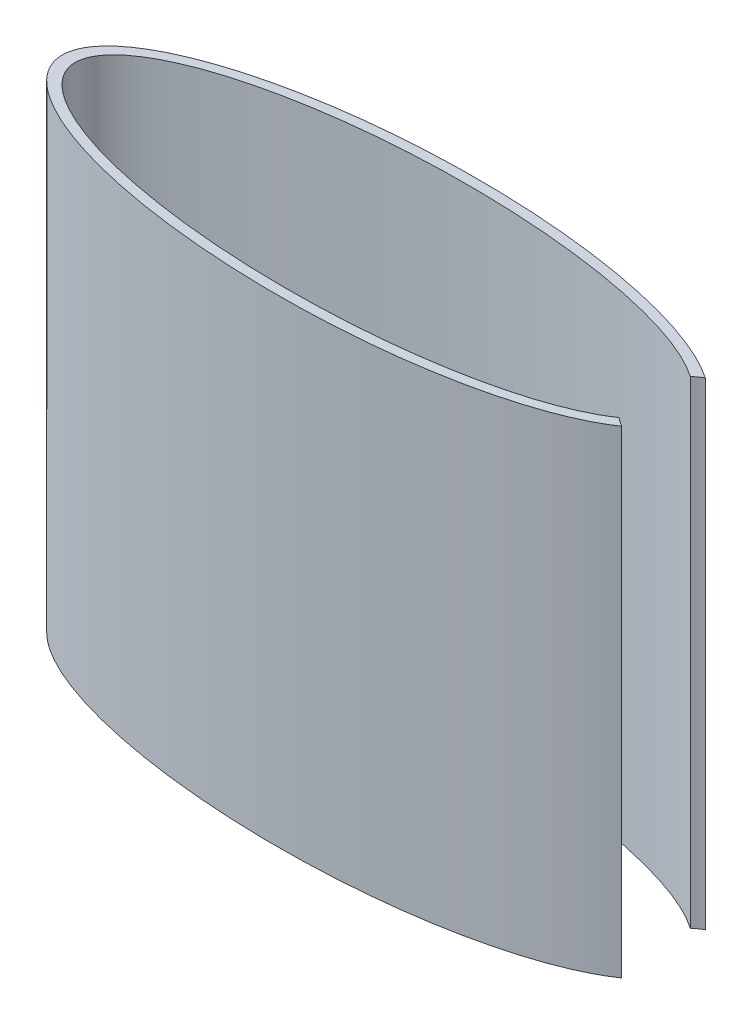
ISO-10303-21;
HEADER;
FILE_DESCRIPTION(('STEP AP214'),'2;1');
FILE_NAME('part.step','',(''),(''),'','','');
FILE_SCHEMA(('AUTOMOTIVE_DESIGN { 1 0 10303 214 1 1 1 1 }'));
ENDSEC;
DATA;
#1=APPLICATION_CONTEXT('core data for automotive mechanical design processes');
#2=APPLICATION_PROTOCOL_DEFINITION('international standard','automotive_design',2000,#1);
#3=PRODUCT_CONTEXT('',#1,'mechanical');
#4=PRODUCT('Part','Part','',(#3));
#5=PRODUCT_RELATED_PRODUCT_CATEGORY('part','',(#4));
#6=PRODUCT_DEFINITION_FORMATION('','',#4);
#7=PRODUCT_DEFINITION_CONTEXT('part definition',#1,'design');
#8=PRODUCT_DEFINITION('design','',#6,#7);
#9=PRODUCT_DEFINITION_SHAPE('','',#8);
#10=(LENGTH_UNIT() NAMED_UNIT(*) SI_UNIT(.MILLI.,.METRE.));
#11=(NAMED_UNIT(*) PLANE_ANGLE_UNIT() SI_UNIT($,.RADIAN.));
#12=(NAMED_UNIT(*) SI_UNIT($,.STERADIAN.) SOLID_ANGLE_UNIT());
#13=UNCERTAINTY_MEASURE_WITH_UNIT(LENGTH_MEASURE(1.E-05),#10,'distance_accuracy_value','');
#14=(GEOMETRIC_REPRESENTATION_CONTEXT(3) GLOBAL_UNCERTAINTY_ASSIGNED_CONTEXT((#13)) GLOBAL_UNIT_ASSIGNED_CONTEXT((#10,
#11,#12)) REPRESENTATION_CONTEXT('',''));
#15=CARTESIAN_POINT('',(0.,0.,0.));
#16=DIRECTION('',(0.,0.,1.));
#17=DIRECTION('',(1.,0.,0.));
#18=AXIS2_PLACEMENT_3D('',#15,#16,#17);
#19=CARTESIAN_POINT('',(0.,127.254,0.));
#20=DIRECTION('',(0.,1.,0.));
#21=DIRECTION('',(0.,0.,1.));
#22=AXIS2_PLACEMENT_3D('',#19,#20,#21);
#23=PLANE('',#22);
#24=CARTESIAN_POINT('',(82.3627691038665,127.254,0.));
#25=DIRECTION('',(0.,1.,0.));
#26=DIRECTION('',(0.,0.,1.));
#27=AXIS2_PLACEMENT_3D('',#24,#25,#26);
#28=CIRCLE('',#27,12.6958795261866);
#29=CARTESIAN_POINT('',(76.2476691465208,127.254,-11.1261363219724));
#30=VERTEX_POINT('',#29);
#31=CARTESIAN_POINT('',(73.9121560052995,127.254,-9.4748348377041));
#32=VERTEX_POINT('',#31);
#33=EDGE_CURVE('E56',#30,#32,#28,.T.);
#34=ORIENTED_EDGE('',*,*,#33,.F.);
#35=CARTESIAN_POINT('',(0.,127.254,0.));
#36=DIRECTION('',(0.,1.,0.));
#37=DIRECTION('',(1.,0.,0.));
#38=AXIS2_PLACEMENT_3D('',#35,#36,#37);
#39=ELLIPSE('',#38,83.8671239744498,26.7152011392463);
#40=CARTESIAN_POINT('',(76.2476691465208,127.254,11.1261363219724));
#41=VERTEX_POINT('',#40);
#42=EDGE_CURVE('E85',#30,#41,#39,.T.);
#43=ORIENTED_EDGE('',*,*,#42,.T.);
#44=CARTESIAN_POINT('',(73.9121560052995,127.254,9.4748348377041));
#45=VERTEX_POINT('',#44);
#46=EDGE_CURVE('E88',#45,#41,#28,.T.);
#47=ORIENTED_EDGE('',*,*,#46,.F.);
#48=CARTESIAN_POINT('',(0.,127.254,0.));
#49=DIRECTION('',(0.,1.,0.));
#50=DIRECTION('',(1.,0.,0.));
#51=AXIS2_PLACEMENT_3D('',#48,#49,#50);
#52=ELLIPSE('',#51,80.4114263146468,24.0569721701671);
#53=EDGE_CURVE('E87',#32,#45,#52,.T.);
#54=ORIENTED_EDGE('',*,*,#53,.F.);
#55=EDGE_LOOP('',(#34,#43,#47,#54));
#56=FACE_BOUND('',#55,.T.);
#57=ADVANCED_FACE('F33',(#56),#23,.T.);
#58=CARTESIAN_POINT('',(0.,0.,0.));
#59=DIRECTION('',(0.,1.,0.));
#60=DIRECTION('',(0.,0.,1.));
#61=AXIS2_PLACEMENT_3D('',#58,#59,#60);
#62=PLANE('',#61);
#63=CARTESIAN_POINT('',(0.,0.,0.));
#64=DIRECTION('',(0.,1.,0.));
#65=DIRECTION('',(1.,0.,0.));
#66=AXIS2_PLACEMENT_3D('',#63,#64,#65);
#67=ELLIPSE('',#66,83.8671239744498,26.7152011392463);
#68=CARTESIAN_POINT('',(76.2476691465208,0.,-11.1261363219724));
#69=VERTEX_POINT('',#68);
#70=CARTESIAN_POINT('',(76.2476691465208,0.,11.1261363219724));
#71=VERTEX_POINT('',#70);
#72=EDGE_CURVE('E92',#69,#71,#67,.T.);
#73=ORIENTED_EDGE('',*,*,#72,.F.);
#74=CARTESIAN_POINT('',(82.3627691038665,0.,0.));
#75=DIRECTION('',(0.,1.,0.));
#76=DIRECTION('',(0.,0.,1.));
#77=AXIS2_PLACEMENT_3D('',#74,#75,#76);
#78=CIRCLE('',#77,12.6958795261866);
#79=CARTESIAN_POINT('',(73.9121560052995,0.,-9.4748348377041));
#80=VERTEX_POINT('',#79);
#81=EDGE_CURVE('E75',#69,#80,#78,.T.);
#82=ORIENTED_EDGE('',*,*,#81,.T.);
#83=CARTESIAN_POINT('',(0.,0.,0.));
#84=DIRECTION('',(0.,1.,0.));
#85=DIRECTION('',(1.,0.,0.));
#86=AXIS2_PLACEMENT_3D('',#83,#84,#85);
#87=ELLIPSE('',#86,80.4114263146468,24.0569721701671);
#88=CARTESIAN_POINT('',(73.9121560052995,0.,9.47483483770412));
#89=VERTEX_POINT('',#88);
#90=EDGE_CURVE('E96',#80,#89,#87,.T.);
#91=ORIENTED_EDGE('',*,*,#90,.T.);
#92=EDGE_CURVE('E48',#89,#71,#78,.T.);
#93=ORIENTED_EDGE('',*,*,#92,.T.);
#94=EDGE_LOOP('',(#73,#82,#91,#93));
#95=FACE_BOUND('',#94,.T.);
#96=ADVANCED_FACE('F109',(#95),#62,.F.);
#97=DIRECTION('',(0.,-1.,0.));
#98=VECTOR('',#97,1.);
#99=SURFACE_OF_LINEAR_EXTRUSION('',#39,#98);
#100=ORIENTED_EDGE('',*,*,#72,.T.);
#101=DIRECTION('',(0.,-1.,0.));
#102=VECTOR('',#101,1.);
#103=CARTESIAN_POINT('',(76.2476691465208,127.254,11.1261363219724));
#104=LINE('',#103,#102);
#105=EDGE_CURVE('E91',#71,#41,#104,.F.);
#106=ORIENTED_EDGE('',*,*,#105,.T.);
#107=ORIENTED_EDGE('',*,*,#42,.F.);
#108=DIRECTION('',(0.,-1.,0.));
#109=VECTOR('',#108,1.);
#110=CARTESIAN_POINT('',(76.2476691465208,127.254,-11.1261363219724));
#111=LINE('',#110,#109);
#112=EDGE_CURVE('E72',#30,#69,#111,.T.);
#113=ORIENTED_EDGE('',*,*,#112,.T.);
#114=EDGE_LOOP('',(#100,#106,#107,#113));
#115=FACE_BOUND('',#114,.T.);
#116=ADVANCED_FACE('F35',(#115),#99,.F.);
#117=DIRECTION('',(0.,-1.,0.));
#118=VECTOR('',#117,1.);
#119=SURFACE_OF_LINEAR_EXTRUSION('',#52,#118);
#120=DIRECTION('',(0.,-1.,0.));
#121=VECTOR('',#120,1.);
#122=CARTESIAN_POINT('',(73.9121560052995,127.254,9.4748348377041));
#123=LINE('',#122,#121);
#124=EDGE_CURVE('E11',#89,#45,#123,.F.);
#125=ORIENTED_EDGE('',*,*,#124,.F.);
#126=ORIENTED_EDGE('',*,*,#90,.F.);
#127=DIRECTION('',(0.,-1.,0.));
#128=VECTOR('',#127,1.);
#129=CARTESIAN_POINT('',(73.9121560052995,127.254,-9.4748348377041));
#130=LINE('',#129,#128);
#131=EDGE_CURVE('E42',#32,#80,#130,.T.);
#132=ORIENTED_EDGE('',*,*,#131,.F.);
#133=ORIENTED_EDGE('',*,*,#53,.T.);
#134=EDGE_LOOP('',(#125,#126,#132,#133));
#135=FACE_BOUND('',#134,.T.);
#136=ADVANCED_FACE('F102',(#135),#119,.T.);
#137=CARTESIAN_POINT('',(82.3627691038665,-30.2260000000001,0.));
#138=DIRECTION('',(0.,1.,0.));
#139=DIRECTION('',(0.,0.,1.));
#140=AXIS2_PLACEMENT_3D('',#137,#138,#139);
#141=CYLINDRICAL_SURFACE('',#140,12.6958795261866);
#142=ORIENTED_EDGE('',*,*,#33,.T.);
#143=ORIENTED_EDGE('',*,*,#131,.T.);
#144=ORIENTED_EDGE('',*,*,#81,.F.);
#145=ORIENTED_EDGE('',*,*,#112,.F.);
#146=EDGE_LOOP('',(#142,#143,#144,#145));
#147=FACE_BOUND('',#146,.T.);
#148=ADVANCED_FACE('F73',(#147),#141,.F.);
#149=ORIENTED_EDGE('',*,*,#92,.F.);
#150=ORIENTED_EDGE('',*,*,#124,.T.);
#151=ORIENTED_EDGE('',*,*,#46,.T.);
#152=ORIENTED_EDGE('',*,*,#105,.F.);
#153=EDGE_LOOP('',(#149,#150,#151,#152));
#154=FACE_BOUND('',#153,.T.);
#155=ADVANCED_FACE('F107',(#154),#141,.F.);
#156=CLOSED_SHELL('',(#57,#96,#116,#136,#148,#155));
#157=MANIFOLD_SOLID_BREP('B2',#156);
#158=ADVANCED_BREP_SHAPE_REPRESENTATION('',(#18,#157),#14);
#159=SHAPE_DEFINITION_REPRESENTATION(#9,#158);
ENDSEC;
END-ISO-10303-21;
